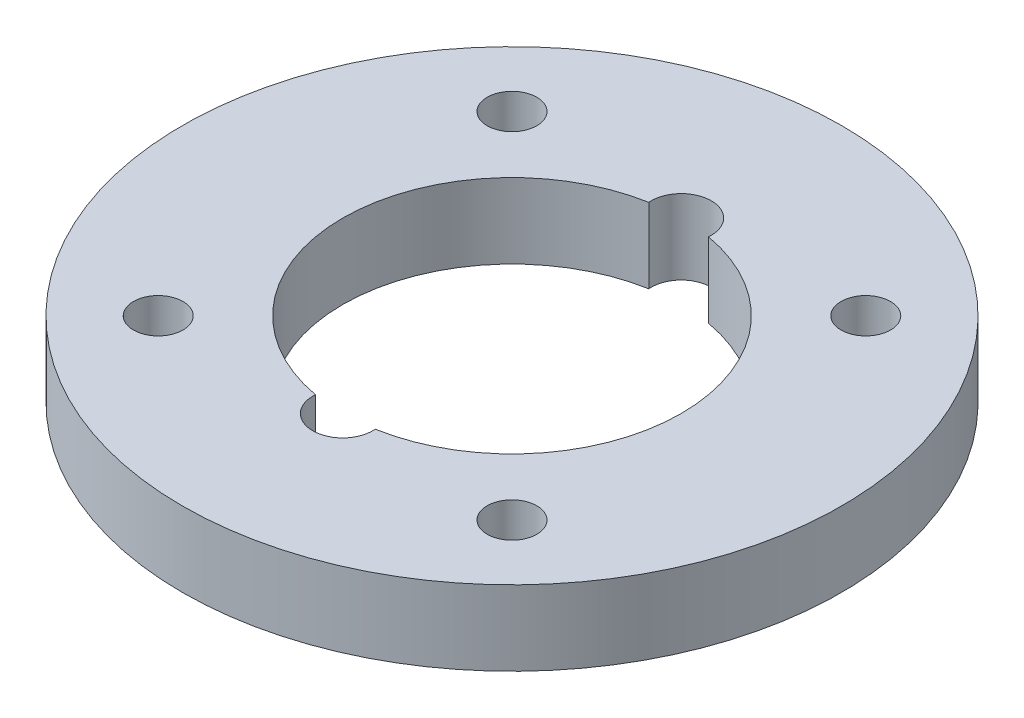
ISO-10303-21;
HEADER;
FILE_DESCRIPTION(('STEP AP214'),'2;1');
FILE_NAME('part.step','',(''),(''),'','','');
FILE_SCHEMA(('AUTOMOTIVE_DESIGN { 1 0 10303 214 1 1 1 1 }'));
ENDSEC;
DATA;
#1=APPLICATION_CONTEXT('core data for automotive mechanical design processes');
#2=APPLICATION_PROTOCOL_DEFINITION('international standard','automotive_design',2000,#1);
#3=PRODUCT_CONTEXT('',#1,'mechanical');
#4=PRODUCT('Part','Part','',(#3));
#5=PRODUCT_RELATED_PRODUCT_CATEGORY('part','',(#4));
#6=PRODUCT_DEFINITION_FORMATION('','',#4);
#7=PRODUCT_DEFINITION_CONTEXT('part definition',#1,'design');
#8=PRODUCT_DEFINITION('design','',#6,#7);
#9=PRODUCT_DEFINITION_SHAPE('','',#8);
#10=(LENGTH_UNIT() NAMED_UNIT(*) SI_UNIT(.MILLI.,.METRE.));
#11=(NAMED_UNIT(*) PLANE_ANGLE_UNIT() SI_UNIT($,.RADIAN.));
#12=(NAMED_UNIT(*) SI_UNIT($,.STERADIAN.) SOLID_ANGLE_UNIT());
#13=UNCERTAINTY_MEASURE_WITH_UNIT(LENGTH_MEASURE(1.E-05),#10,'distance_accuracy_value','');
#14=(GEOMETRIC_REPRESENTATION_CONTEXT(3) GLOBAL_UNCERTAINTY_ASSIGNED_CONTEXT((#13)) GLOBAL_UNIT_ASSIGNED_CONTEXT((#10,
#11,#12)) REPRESENTATION_CONTEXT('',''));
#15=CARTESIAN_POINT('',(0.,0.,0.));
#16=DIRECTION('',(0.,0.,1.));
#17=DIRECTION('',(1.,0.,0.));
#18=AXIS2_PLACEMENT_3D('',#15,#16,#17);
#19=CARTESIAN_POINT('',(0.,6.35,14.351));
#20=DIRECTION('',(0.,-1.,0.));
#21=DIRECTION('',(0.,0.,-1.));
#22=AXIS2_PLACEMENT_3D('',#19,#20,#21);
#23=CYLINDRICAL_SURFACE('',#22,2.53999999999997);
#24=CARTESIAN_POINT('',(0.,0.,14.351));
#25=DIRECTION('',(0.,1.,0.));
#26=DIRECTION('',(0.,0.,1.));
#27=AXIS2_PLACEMENT_3D('',#24,#25,#26);
#28=CIRCLE('',#27,2.53999999999997);
#29=CARTESIAN_POINT('',(2.53003448762568,0.,14.1262212389381));
#30=VERTEX_POINT('',#29);
#31=CARTESIAN_POINT('',(-2.53003448762568,0.,14.1262212389381));
#32=VERTEX_POINT('',#31);
#33=EDGE_CURVE('E117',#30,#32,#28,.F.);
#34=ORIENTED_EDGE('',*,*,#33,.T.);
#35=DIRECTION('',(0.,-1.,0.));
#36=VECTOR('',#35,1.);
#37=CARTESIAN_POINT('',(-2.53003448762568,6.35,14.1262212389381));
#38=LINE('',#37,#36);
#39=CARTESIAN_POINT('',(-2.53003448762568,6.35,14.1262212389381));
#40=VERTEX_POINT('',#39);
#41=EDGE_CURVE('E11',#40,#32,#38,.T.);
#42=ORIENTED_EDGE('',*,*,#41,.F.);
#43=CARTESIAN_POINT('',(0.,6.35,14.351));
#44=DIRECTION('',(0.,1.,0.));
#45=DIRECTION('',(0.,0.,1.));
#46=AXIS2_PLACEMENT_3D('',#43,#44,#45);
#47=CIRCLE('',#46,2.53999999999997);
#48=CARTESIAN_POINT('',(2.53003448762568,6.35,14.1262212389381));
#49=VERTEX_POINT('',#48);
#50=EDGE_CURVE('E91',#49,#40,#47,.F.);
#51=ORIENTED_EDGE('',*,*,#50,.F.);
#52=DIRECTION('',(0.,-1.,0.));
#53=VECTOR('',#52,1.);
#54=CARTESIAN_POINT('',(2.53003448762568,6.35,14.1262212389381));
#55=LINE('',#54,#53);
#56=EDGE_CURVE('E101',#49,#30,#55,.T.);
#57=ORIENTED_EDGE('',*,*,#56,.T.);
#58=EDGE_LOOP('',(#34,#42,#51,#57));
#59=FACE_BOUND('',#58,.T.);
#60=ADVANCED_FACE('F41',(#59),#23,.F.);
#61=CARTESIAN_POINT('',(0.,6.35,0.));
#62=DIRECTION('',(0.,-1.,0.));
#63=DIRECTION('',(0.,0.,-1.));
#64=AXIS2_PLACEMENT_3D('',#61,#62,#63);
#65=CYLINDRICAL_SURFACE('',#64,14.351);
#66=CARTESIAN_POINT('',(0.,0.,0.));
#67=DIRECTION('',(0.,1.,0.));
#68=DIRECTION('',(0.,0.,1.));
#69=AXIS2_PLACEMENT_3D('',#66,#67,#68);
#70=CIRCLE('',#69,14.351);
#71=CARTESIAN_POINT('',(-2.53003448762579,0.,-14.1262212389381));
#72=VERTEX_POINT('',#71);
#73=EDGE_CURVE('E100',#32,#72,#70,.F.);
#74=ORIENTED_EDGE('',*,*,#73,.T.);
#75=DIRECTION('',(0.,-1.,0.));
#76=VECTOR('',#75,1.);
#77=CARTESIAN_POINT('',(-2.53003448762579,6.35,-14.1262212389381));
#78=LINE('',#77,#76);
#79=CARTESIAN_POINT('',(-2.53003448762579,6.35,-14.1262212389381));
#80=VERTEX_POINT('',#79);
#81=EDGE_CURVE('E49',#80,#72,#78,.T.);
#82=ORIENTED_EDGE('',*,*,#81,.F.);
#83=CARTESIAN_POINT('',(0.,6.35,0.));
#84=DIRECTION('',(0.,1.,0.));
#85=DIRECTION('',(0.,0.,1.));
#86=AXIS2_PLACEMENT_3D('',#83,#84,#85);
#87=CIRCLE('',#86,14.351);
#88=EDGE_CURVE('E86',#40,#80,#87,.F.);
#89=ORIENTED_EDGE('',*,*,#88,.F.);
#90=ORIENTED_EDGE('',*,*,#41,.T.);
#91=EDGE_LOOP('',(#74,#82,#89,#90));
#92=FACE_BOUND('',#91,.T.);
#93=ADVANCED_FACE('F96',(#92),#65,.F.);
#94=CARTESIAN_POINT('',(0.,6.35,-14.351));
#95=DIRECTION('',(0.,-1.,0.));
#96=DIRECTION('',(0.,0.,-1.));
#97=AXIS2_PLACEMENT_3D('',#94,#95,#96);
#98=CYLINDRICAL_SURFACE('',#97,2.54000000000008);
#99=CARTESIAN_POINT('',(0.,0.,-14.351));
#100=DIRECTION('',(0.,1.,0.));
#101=DIRECTION('',(0.,0.,1.));
#102=AXIS2_PLACEMENT_3D('',#99,#100,#101);
#103=CIRCLE('',#102,2.54000000000008);
#104=CARTESIAN_POINT('',(2.53003448762579,0.,-14.1262212389381));
#105=VERTEX_POINT('',#104);
#106=EDGE_CURVE('E73',#72,#105,#103,.F.);
#107=ORIENTED_EDGE('',*,*,#106,.T.);
#108=DIRECTION('',(0.,-1.,0.));
#109=VECTOR('',#108,1.);
#110=CARTESIAN_POINT('',(2.53003448762579,6.35,-14.1262212389381));
#111=LINE('',#110,#109);
#112=CARTESIAN_POINT('',(2.53003448762579,6.35,-14.1262212389381));
#113=VERTEX_POINT('',#112);
#114=EDGE_CURVE('E98',#113,#105,#111,.T.);
#115=ORIENTED_EDGE('',*,*,#114,.F.);
#116=CARTESIAN_POINT('',(0.,6.35,-14.351));
#117=DIRECTION('',(0.,1.,0.));
#118=DIRECTION('',(0.,0.,1.));
#119=AXIS2_PLACEMENT_3D('',#116,#117,#118);
#120=CIRCLE('',#119,2.54000000000008);
#121=EDGE_CURVE('E93',#80,#113,#120,.F.);
#122=ORIENTED_EDGE('',*,*,#121,.F.);
#123=ORIENTED_EDGE('',*,*,#81,.T.);
#124=EDGE_LOOP('',(#107,#115,#122,#123));
#125=FACE_BOUND('',#124,.T.);
#126=ADVANCED_FACE('F97',(#125),#98,.F.);
#127=CARTESIAN_POINT('',(0.,6.35,0.));
#128=DIRECTION('',(0.,-1.,0.));
#129=DIRECTION('',(0.,0.,-1.));
#130=AXIS2_PLACEMENT_3D('',#127,#128,#129);
#131=CYLINDRICAL_SURFACE('',#130,27.94);
#132=CARTESIAN_POINT('',(0.,6.35,0.));
#133=DIRECTION('',(0.,1.,0.));
#134=DIRECTION('',(0.,0.,1.));
#135=AXIS2_PLACEMENT_3D('',#132,#133,#134);
#136=CIRCLE('',#135,27.94);
#137=CARTESIAN_POINT('',(0.,6.35,27.94));
#138=VERTEX_POINT('',#137);
#139=EDGE_CURVE('E135',#138,#138,#136,.T.);
#140=ORIENTED_EDGE('',*,*,#139,.F.);
#141=EDGE_LOOP('',(#140));
#142=FACE_BOUND('',#141,.T.);
#143=CARTESIAN_POINT('',(0.,0.,0.));
#144=DIRECTION('',(0.,1.,0.));
#145=DIRECTION('',(0.,0.,1.));
#146=AXIS2_PLACEMENT_3D('',#143,#144,#145);
#147=CIRCLE('',#146,27.94);
#148=CARTESIAN_POINT('',(0.,0.,27.94));
#149=VERTEX_POINT('',#148);
#150=EDGE_CURVE('E116',#149,#149,#147,.T.);
#151=ORIENTED_EDGE('',*,*,#150,.T.);
#152=EDGE_LOOP('',(#151));
#153=FACE_BOUND('',#152,.T.);
#154=ADVANCED_FACE('F165',(#142,#153),#131,.T.);
#155=CARTESIAN_POINT('',(14.9970277221856,6.35,14.9970277221853));
#156=DIRECTION('',(0.,-1.,0.));
#157=DIRECTION('',(0.,0.,-1.));
#158=AXIS2_PLACEMENT_3D('',#155,#156,#157);
#159=CYLINDRICAL_SURFACE('',#158,2.1);
#160=CARTESIAN_POINT('',(14.9970277221856,6.35,14.9970277221853));
#161=DIRECTION('',(0.,1.,0.));
#162=DIRECTION('',(0.,0.,1.));
#163=AXIS2_PLACEMENT_3D('',#160,#161,#162);
#164=CIRCLE('',#163,2.1);
#165=CARTESIAN_POINT('',(14.9970277221856,6.35,17.0970277221853));
#166=VERTEX_POINT('',#165);
#167=EDGE_CURVE('E132',#166,#166,#164,.T.);
#168=ORIENTED_EDGE('',*,*,#167,.T.);
#169=EDGE_LOOP('',(#168));
#170=FACE_BOUND('',#169,.T.);
#171=CARTESIAN_POINT('',(14.9970277221856,0.,14.9970277221853));
#172=DIRECTION('',(0.,1.,0.));
#173=DIRECTION('',(0.,0.,1.));
#174=AXIS2_PLACEMENT_3D('',#171,#172,#173);
#175=CIRCLE('',#174,2.1);
#176=CARTESIAN_POINT('',(14.9970277221856,0.,17.0970277221853));
#177=VERTEX_POINT('',#176);
#178=EDGE_CURVE('E111',#177,#177,#175,.T.);
#179=ORIENTED_EDGE('',*,*,#178,.F.);
#180=EDGE_LOOP('',(#179));
#181=FACE_BOUND('',#180,.T.);
#182=ADVANCED_FACE('F164',(#170,#181),#159,.F.);
#183=CARTESIAN_POINT('',(14.9970277221854,6.35,-14.9970277221856));
#184=DIRECTION('',(0.,-1.,0.));
#185=DIRECTION('',(0.,0.,-1.));
#186=AXIS2_PLACEMENT_3D('',#183,#184,#185);
#187=CYLINDRICAL_SURFACE('',#186,2.1);
#188=CARTESIAN_POINT('',(14.9970277221854,6.35,-14.9970277221856));
#189=DIRECTION('',(0.,1.,0.));
#190=DIRECTION('',(0.,0.,1.));
#191=AXIS2_PLACEMENT_3D('',#188,#189,#190);
#192=CIRCLE('',#191,2.1);
#193=CARTESIAN_POINT('',(14.9970277221854,6.35,-12.8970277221856));
#194=VERTEX_POINT('',#193);
#195=EDGE_CURVE('E139',#194,#194,#192,.T.);
#196=ORIENTED_EDGE('',*,*,#195,.T.);
#197=EDGE_LOOP('',(#196));
#198=FACE_BOUND('',#197,.T.);
#199=CARTESIAN_POINT('',(14.9970277221854,0.,-14.9970277221856));
#200=DIRECTION('',(0.,1.,0.));
#201=DIRECTION('',(0.,0.,1.));
#202=AXIS2_PLACEMENT_3D('',#199,#200,#201);
#203=CIRCLE('',#202,2.1);
#204=CARTESIAN_POINT('',(14.9970277221854,0.,-12.8970277221856));
#205=VERTEX_POINT('',#204);
#206=EDGE_CURVE('E112',#205,#205,#203,.T.);
#207=ORIENTED_EDGE('',*,*,#206,.F.);
#208=EDGE_LOOP('',(#207));
#209=FACE_BOUND('',#208,.T.);
#210=ADVANCED_FACE('F189',(#198,#209),#187,.F.);
#211=CARTESIAN_POINT('',(-14.9970277221856,6.35,-14.9970277221853));
#212=DIRECTION('',(0.,-1.,0.));
#213=DIRECTION('',(0.,0.,-1.));
#214=AXIS2_PLACEMENT_3D('',#211,#212,#213);
#215=CYLINDRICAL_SURFACE('',#214,2.10000000000001);
#216=CARTESIAN_POINT('',(-14.9970277221856,6.35,-14.9970277221853));
#217=DIRECTION('',(0.,1.,0.));
#218=DIRECTION('',(0.,0.,1.));
#219=AXIS2_PLACEMENT_3D('',#216,#217,#218);
#220=CIRCLE('',#219,2.10000000000001);
#221=CARTESIAN_POINT('',(-14.9970277221856,6.35,-12.8970277221853));
#222=VERTEX_POINT('',#221);
#223=EDGE_CURVE('E141',#222,#222,#220,.T.);
#224=ORIENTED_EDGE('',*,*,#223,.T.);
#225=EDGE_LOOP('',(#224));
#226=FACE_BOUND('',#225,.T.);
#227=CARTESIAN_POINT('',(-14.9970277221856,0.,-14.9970277221853));
#228=DIRECTION('',(0.,1.,0.));
#229=DIRECTION('',(0.,0.,1.));
#230=AXIS2_PLACEMENT_3D('',#227,#228,#229);
#231=CIRCLE('',#230,2.10000000000001);
#232=CARTESIAN_POINT('',(-14.9970277221856,0.,-12.8970277221853));
#233=VERTEX_POINT('',#232);
#234=EDGE_CURVE('E107',#233,#233,#231,.T.);
#235=ORIENTED_EDGE('',*,*,#234,.F.);
#236=EDGE_LOOP('',(#235));
#237=FACE_BOUND('',#236,.T.);
#238=ADVANCED_FACE('F188',(#226,#237),#215,.F.);
#239=CARTESIAN_POINT('',(-14.9970277221854,6.35,14.9970277221856));
#240=DIRECTION('',(0.,-1.,0.));
#241=DIRECTION('',(0.,0.,-1.));
#242=AXIS2_PLACEMENT_3D('',#239,#240,#241);
#243=CYLINDRICAL_SURFACE('',#242,2.1);
#244=CARTESIAN_POINT('',(-14.9970277221854,6.35,14.9970277221856));
#245=DIRECTION('',(0.,1.,0.));
#246=DIRECTION('',(0.,0.,1.));
#247=AXIS2_PLACEMENT_3D('',#244,#245,#246);
#248=CIRCLE('',#247,2.1);
#249=CARTESIAN_POINT('',(-14.9970277221854,6.35,17.0970277221856));
#250=VERTEX_POINT('',#249);
#251=EDGE_CURVE('E127',#250,#250,#248,.T.);
#252=ORIENTED_EDGE('',*,*,#251,.T.);
#253=EDGE_LOOP('',(#252));
#254=FACE_BOUND('',#253,.T.);
#255=CARTESIAN_POINT('',(-14.9970277221854,0.,14.9970277221856));
#256=DIRECTION('',(0.,1.,0.));
#257=DIRECTION('',(0.,0.,1.));
#258=AXIS2_PLACEMENT_3D('',#255,#256,#257);
#259=CIRCLE('',#258,2.1);
#260=CARTESIAN_POINT('',(-14.9970277221854,0.,17.0970277221856));
#261=VERTEX_POINT('',#260);
#262=EDGE_CURVE('E104',#261,#261,#259,.T.);
#263=ORIENTED_EDGE('',*,*,#262,.F.);
#264=EDGE_LOOP('',(#263));
#265=FACE_BOUND('',#264,.T.);
#266=ADVANCED_FACE('F43',(#254,#265),#243,.F.);
#267=CARTESIAN_POINT('',(0.,6.35,0.));
#268=DIRECTION('',(0.,-1.,0.));
#269=DIRECTION('',(0.,0.,-1.));
#270=AXIS2_PLACEMENT_3D('',#267,#268,#269);
#271=CYLINDRICAL_SURFACE('',#270,14.351);
#272=CARTESIAN_POINT('',(0.,0.,0.));
#273=DIRECTION('',(0.,1.,0.));
#274=DIRECTION('',(0.,0.,1.));
#275=AXIS2_PLACEMENT_3D('',#272,#273,#274);
#276=CIRCLE('',#275,14.351);
#277=EDGE_CURVE('E81',#105,#30,#276,.F.);
#278=ORIENTED_EDGE('',*,*,#277,.T.);
#279=ORIENTED_EDGE('',*,*,#56,.F.);
#280=CARTESIAN_POINT('',(0.,6.35,0.));
#281=DIRECTION('',(0.,1.,0.));
#282=DIRECTION('',(0.,0.,1.));
#283=AXIS2_PLACEMENT_3D('',#280,#281,#282);
#284=CIRCLE('',#283,14.351);
#285=EDGE_CURVE('E59',#113,#49,#284,.F.);
#286=ORIENTED_EDGE('',*,*,#285,.F.);
#287=ORIENTED_EDGE('',*,*,#114,.T.);
#288=EDGE_LOOP('',(#278,#279,#286,#287));
#289=FACE_BOUND('',#288,.T.);
#290=ADVANCED_FACE('F126',(#289),#271,.F.);
#291=CARTESIAN_POINT('',(0.,6.35,0.));
#292=DIRECTION('',(0.,1.,0.));
#293=DIRECTION('',(0.,0.,1.));
#294=AXIS2_PLACEMENT_3D('',#291,#292,#293);
#295=PLANE('',#294);
#296=ORIENTED_EDGE('',*,*,#251,.F.);
#297=EDGE_LOOP('',(#296));
#298=FACE_BOUND('',#297,.T.);
#299=ORIENTED_EDGE('',*,*,#223,.F.);
#300=EDGE_LOOP('',(#299));
#301=FACE_BOUND('',#300,.T.);
#302=ORIENTED_EDGE('',*,*,#195,.F.);
#303=EDGE_LOOP('',(#302));
#304=FACE_BOUND('',#303,.T.);
#305=ORIENTED_EDGE('',*,*,#167,.F.);
#306=EDGE_LOOP('',(#305));
#307=FACE_BOUND('',#306,.T.);
#308=ORIENTED_EDGE('',*,*,#139,.T.);
#309=EDGE_LOOP('',(#308));
#310=FACE_BOUND('',#309,.T.);
#311=ORIENTED_EDGE('',*,*,#50,.T.);
#312=ORIENTED_EDGE('',*,*,#88,.T.);
#313=ORIENTED_EDGE('',*,*,#121,.T.);
#314=ORIENTED_EDGE('',*,*,#285,.T.);
#315=EDGE_LOOP('',(#311,#312,#313,#314));
#316=FACE_BOUND('',#315,.T.);
#317=ADVANCED_FACE('F90',(#298,#301,#304,#307,#310,#316),#295,.T.);
#318=CARTESIAN_POINT('',(0.,0.,0.));
#319=DIRECTION('',(0.,1.,0.));
#320=DIRECTION('',(0.,0.,1.));
#321=AXIS2_PLACEMENT_3D('',#318,#319,#320);
#322=PLANE('',#321);
#323=ORIENTED_EDGE('',*,*,#262,.T.);
#324=EDGE_LOOP('',(#323));
#325=FACE_BOUND('',#324,.T.);
#326=ORIENTED_EDGE('',*,*,#234,.T.);
#327=EDGE_LOOP('',(#326));
#328=FACE_BOUND('',#327,.T.);
#329=ORIENTED_EDGE('',*,*,#206,.T.);
#330=EDGE_LOOP('',(#329));
#331=FACE_BOUND('',#330,.T.);
#332=ORIENTED_EDGE('',*,*,#178,.T.);
#333=EDGE_LOOP('',(#332));
#334=FACE_BOUND('',#333,.T.);
#335=ORIENTED_EDGE('',*,*,#150,.F.);
#336=EDGE_LOOP('',(#335));
#337=FACE_BOUND('',#336,.T.);
#338=ORIENTED_EDGE('',*,*,#33,.F.);
#339=ORIENTED_EDGE('',*,*,#277,.F.);
#340=ORIENTED_EDGE('',*,*,#106,.F.);
#341=ORIENTED_EDGE('',*,*,#73,.F.);
#342=EDGE_LOOP('',(#338,#339,#340,#341));
#343=FACE_BOUND('',#342,.T.);
#344=ADVANCED_FACE('F134',(#325,#328,#331,#334,#337,#343),#322,.F.);
#345=CLOSED_SHELL('',(#60,#93,#126,#154,#182,#210,#238,#266,#290,#317,#344));
#346=MANIFOLD_SOLID_BREP('B2',#345);
#347=ADVANCED_BREP_SHAPE_REPRESENTATION('',(#18,#346),#14);
#348=SHAPE_DEFINITION_REPRESENTATION(#9,#347);
ENDSEC;
END-ISO-10303-21;
